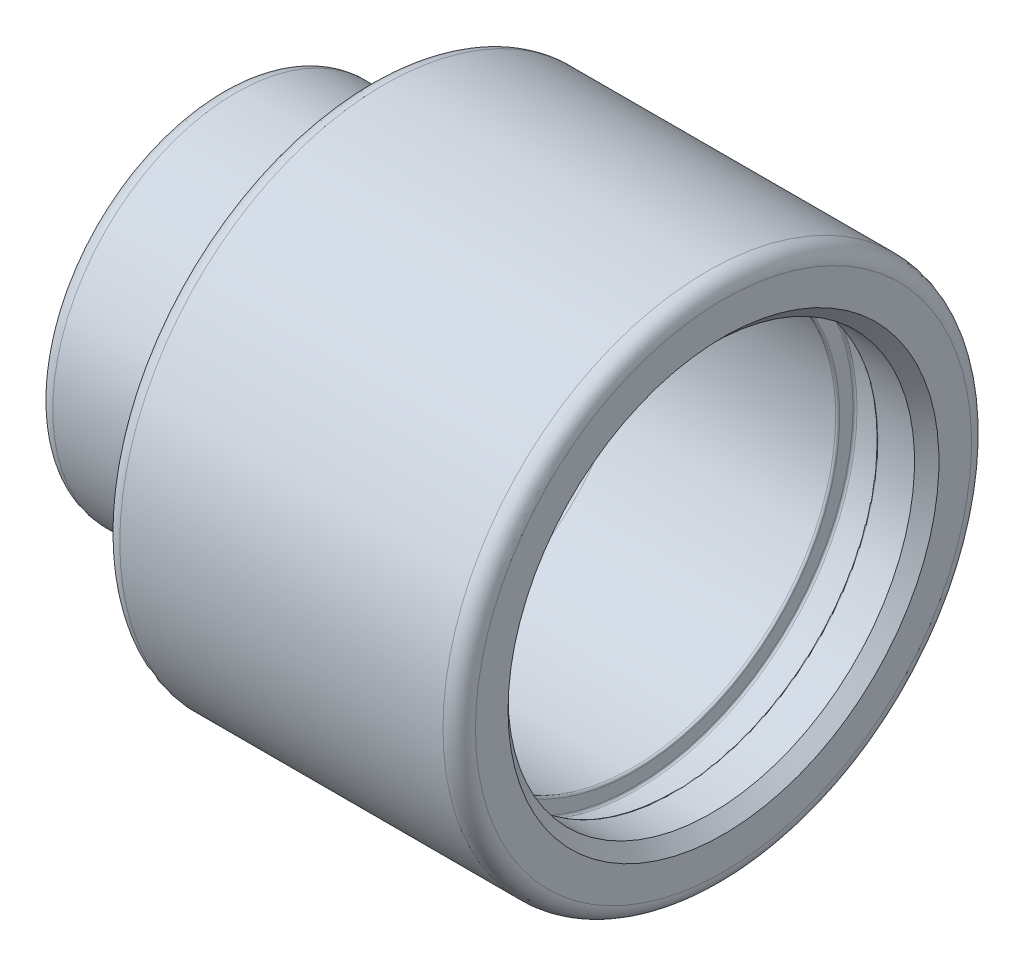
ISO-10303-21;
HEADER;
FILE_DESCRIPTION(('STEP AP214'),'2;1');
FILE_NAME('part.step','',(''),(''),'','','');
FILE_SCHEMA(('AUTOMOTIVE_DESIGN { 1 0 10303 214 1 1 1 1 }'));
ENDSEC;
DATA;
#1=APPLICATION_CONTEXT('core data for automotive mechanical design processes');
#2=APPLICATION_PROTOCOL_DEFINITION('international standard','automotive_design',2000,#1);
#3=PRODUCT_CONTEXT('',#1,'mechanical');
#4=PRODUCT('Part','Part','',(#3));
#5=PRODUCT_RELATED_PRODUCT_CATEGORY('part','',(#4));
#6=PRODUCT_DEFINITION_FORMATION('','',#4);
#7=PRODUCT_DEFINITION_CONTEXT('part definition',#1,'design');
#8=PRODUCT_DEFINITION('design','',#6,#7);
#9=PRODUCT_DEFINITION_SHAPE('','',#8);
#10=(LENGTH_UNIT() NAMED_UNIT(*) SI_UNIT(.MILLI.,.METRE.));
#11=(NAMED_UNIT(*) PLANE_ANGLE_UNIT() SI_UNIT($,.RADIAN.));
#12=(NAMED_UNIT(*) SI_UNIT($,.STERADIAN.) SOLID_ANGLE_UNIT());
#13=UNCERTAINTY_MEASURE_WITH_UNIT(LENGTH_MEASURE(1.E-05),#10,'distance_accuracy_value','');
#14=(GEOMETRIC_REPRESENTATION_CONTEXT(3) GLOBAL_UNCERTAINTY_ASSIGNED_CONTEXT((#13)) GLOBAL_UNIT_ASSIGNED_CONTEXT((#10,
#11,#12)) REPRESENTATION_CONTEXT('',''));
#15=CARTESIAN_POINT('',(0.,0.,0.));
#16=DIRECTION('',(0.,0.,1.));
#17=DIRECTION('',(1.,0.,0.));
#18=AXIS2_PLACEMENT_3D('',#15,#16,#17);
#19=CARTESIAN_POINT('',(-27.6897335930288,11.43,0.));
#20=DIRECTION('',(1.,0.,0.));
#21=DIRECTION('',(0.,0.,-1.));
#22=AXIS2_PLACEMENT_3D('',#19,#20,#21);
#23=PLANE('',#22);
#24=CARTESIAN_POINT('',(-27.6897335930288,0.,0.));
#25=DIRECTION('',(1.,0.,0.));
#26=DIRECTION('',(0.,0.,-1.));
#27=AXIS2_PLACEMENT_3D('',#24,#25,#26);
#28=CIRCLE('',#27,10.414);
#29=CARTESIAN_POINT('',(-27.6897335930288,0.,-10.414));
#30=VERTEX_POINT('',#29);
#31=EDGE_CURVE('E102',#30,#30,#28,.F.);
#32=ORIENTED_EDGE('',*,*,#31,.T.);
#33=EDGE_LOOP('',(#32));
#34=FACE_BOUND('',#33,.T.);
#35=CARTESIAN_POINT('',(-27.6897335930288,0.,0.));
#36=DIRECTION('',(1.,0.,0.));
#37=DIRECTION('',(0.,0.,-1.));
#38=AXIS2_PLACEMENT_3D('',#35,#36,#37);
#39=CIRCLE('',#38,8.38199999999997);
#40=CARTESIAN_POINT('',(-27.6897335930288,0.,-8.38199999999997));
#41=VERTEX_POINT('',#40);
#42=EDGE_CURVE('E132',#41,#41,#39,.T.);
#43=ORIENTED_EDGE('',*,*,#42,.T.);
#44=EDGE_LOOP('',(#43));
#45=FACE_BOUND('',#44,.T.);
#46=ADVANCED_FACE('F34',(#34,#45),#23,.F.);
#47=CARTESIAN_POINT('',(-425.207935606635,0.,0.));
#48=DIRECTION('',(-1.,0.,0.));
#49=DIRECTION('',(0.,0.,1.));
#50=AXIS2_PLACEMENT_3D('',#47,#48,#49);
#51=CYLINDRICAL_SURFACE('',#50,7.62);
#52=CARTESIAN_POINT('',(-24.6417335930288,0.,0.));
#53=DIRECTION('',(-1.,0.,0.));
#54=DIRECTION('',(0.,0.,1.));
#55=AXIS2_PLACEMENT_3D('',#52,#53,#54);
#56=CIRCLE('',#55,7.62);
#57=CARTESIAN_POINT('',(-24.6417335930288,0.,7.62));
#58=VERTEX_POINT('',#57);
#59=EDGE_CURVE('E81',#58,#58,#56,.F.);
#60=ORIENTED_EDGE('',*,*,#59,.T.);
#61=EDGE_LOOP('',(#60));
#62=FACE_BOUND('',#61,.T.);
#63=CARTESIAN_POINT('',(-26.9277335930289,0.,0.));
#64=DIRECTION('',(1.,0.,0.));
#65=DIRECTION('',(0.,0.,-1.));
#66=AXIS2_PLACEMENT_3D('',#63,#64,#65);
#67=CIRCLE('',#66,7.62);
#68=CARTESIAN_POINT('',(-26.9277335930289,0.,-7.62));
#69=VERTEX_POINT('',#68);
#70=EDGE_CURVE('E135',#69,#69,#67,.F.);
#71=ORIENTED_EDGE('',*,*,#70,.T.);
#72=EDGE_LOOP('',(#71));
#73=FACE_BOUND('',#72,.T.);
#74=ADVANCED_FACE('F139',(#62,#73),#51,.F.);
#75=CARTESIAN_POINT('',(-24.5147335930288,7.62,0.));
#76=DIRECTION('',(-1.,0.,0.));
#77=DIRECTION('',(0.,0.,1.));
#78=AXIS2_PLACEMENT_3D('',#75,#76,#77);
#79=PLANE('',#78);
#80=CARTESIAN_POINT('',(-24.5147335930288,0.,0.));
#81=DIRECTION('',(-1.,0.,0.));
#82=DIRECTION('',(0.,0.,1.));
#83=AXIS2_PLACEMENT_3D('',#80,#81,#82);
#84=CIRCLE('',#83,7.747);
#85=CARTESIAN_POINT('',(-24.5147335930288,0.,7.747));
#86=VERTEX_POINT('',#85);
#87=EDGE_CURVE('E84',#86,#86,#84,.T.);
#88=ORIENTED_EDGE('',*,*,#87,.T.);
#89=EDGE_LOOP('',(#88));
#90=FACE_BOUND('',#89,.T.);
#91=CARTESIAN_POINT('',(-24.5147335930288,0.,0.));
#92=DIRECTION('',(-1.,0.,0.));
#93=DIRECTION('',(0.,0.,1.));
#94=AXIS2_PLACEMENT_3D('',#91,#92,#93);
#95=CIRCLE('',#94,8.636);
#96=CARTESIAN_POINT('',(-24.5147335930288,0.,8.636));
#97=VERTEX_POINT('',#96);
#98=EDGE_CURVE('E87',#97,#97,#95,.F.);
#99=ORIENTED_EDGE('',*,*,#98,.T.);
#100=EDGE_LOOP('',(#99));
#101=FACE_BOUND('',#100,.T.);
#102=ADVANCED_FACE('F166',(#90,#101),#79,.F.);
#103=CARTESIAN_POINT('',(-425.207935606635,0.,0.));
#104=DIRECTION('',(-1.,0.,0.));
#105=DIRECTION('',(0.,0.,1.));
#106=AXIS2_PLACEMENT_3D('',#103,#104,#105);
#107=CYLINDRICAL_SURFACE('',#106,8.763);
#108=CARTESIAN_POINT('',(-24.3877335930288,0.,0.));
#109=DIRECTION('',(-1.,0.,0.));
#110=DIRECTION('',(0.,0.,1.));
#111=AXIS2_PLACEMENT_3D('',#108,#109,#110);
#112=CIRCLE('',#111,8.763);
#113=CARTESIAN_POINT('',(-24.3877335930288,0.,8.763));
#114=VERTEX_POINT('',#113);
#115=EDGE_CURVE('E75',#114,#114,#112,.T.);
#116=ORIENTED_EDGE('',*,*,#115,.T.);
#117=EDGE_LOOP('',(#116));
#118=FACE_BOUND('',#117,.T.);
#119=CARTESIAN_POINT('',(-22.2541335930288,0.,0.));
#120=DIRECTION('',(1.,0.,0.));
#121=DIRECTION('',(0.,0.,-1.));
#122=AXIS2_PLACEMENT_3D('',#119,#120,#121);
#123=CIRCLE('',#122,8.763);
#124=CARTESIAN_POINT('',(-22.2541335930288,0.,-8.763));
#125=VERTEX_POINT('',#124);
#126=EDGE_CURVE('E78',#125,#125,#123,.T.);
#127=ORIENTED_EDGE('',*,*,#126,.T.);
#128=EDGE_LOOP('',(#127));
#129=FACE_BOUND('',#128,.T.);
#130=ADVANCED_FACE('F173',(#118,#129),#107,.F.);
#131=CARTESIAN_POINT('',(-22.1271335930288,8.763,0.));
#132=DIRECTION('',(1.,0.,0.));
#133=DIRECTION('',(0.,0.,-1.));
#134=AXIS2_PLACEMENT_3D('',#131,#132,#133);
#135=PLANE('',#134);
#136=CARTESIAN_POINT('',(-22.1271335930288,0.,0.));
#137=DIRECTION('',(1.,0.,0.));
#138=DIRECTION('',(0.,0.,-1.));
#139=AXIS2_PLACEMENT_3D('',#136,#137,#138);
#140=CIRCLE('',#139,8.636);
#141=CARTESIAN_POINT('',(-22.1271335930288,0.,-8.636));
#142=VERTEX_POINT('',#141);
#143=EDGE_CURVE('E69',#142,#142,#140,.F.);
#144=ORIENTED_EDGE('',*,*,#143,.T.);
#145=EDGE_LOOP('',(#144));
#146=FACE_BOUND('',#145,.T.);
#147=CARTESIAN_POINT('',(-22.1271335930288,0.,0.));
#148=DIRECTION('',(1.,0.,0.));
#149=DIRECTION('',(0.,0.,-1.));
#150=AXIS2_PLACEMENT_3D('',#147,#148,#149);
#151=CIRCLE('',#150,7.747);
#152=CARTESIAN_POINT('',(-22.1271335930288,0.,-7.747));
#153=VERTEX_POINT('',#152);
#154=EDGE_CURVE('E72',#153,#153,#151,.T.);
#155=ORIENTED_EDGE('',*,*,#154,.T.);
#156=EDGE_LOOP('',(#155));
#157=FACE_BOUND('',#156,.T.);
#158=ADVANCED_FACE('F177',(#146,#157),#135,.F.);
#159=CARTESIAN_POINT('',(-425.207935606635,0.,0.));
#160=DIRECTION('',(-1.,0.,0.));
#161=DIRECTION('',(0.,0.,1.));
#162=AXIS2_PLACEMENT_3D('',#159,#160,#161);
#163=CYLINDRICAL_SURFACE('',#162,7.62);
#164=CARTESIAN_POINT('',(-22.0001335930288,0.,0.));
#165=DIRECTION('',(1.,0.,0.));
#166=DIRECTION('',(0.,0.,-1.));
#167=AXIS2_PLACEMENT_3D('',#164,#165,#166);
#168=CIRCLE('',#167,7.62);
#169=CARTESIAN_POINT('',(-22.0001335930288,0.,-7.62));
#170=VERTEX_POINT('',#169);
#171=EDGE_CURVE('E66',#170,#170,#168,.F.);
#172=ORIENTED_EDGE('',*,*,#171,.T.);
#173=EDGE_LOOP('',(#172));
#174=FACE_BOUND('',#173,.T.);
#175=CARTESIAN_POINT('',(-16.7677335930288,0.,0.));
#176=DIRECTION('',(-1.,0.,0.));
#177=DIRECTION('',(0.,0.,1.));
#178=AXIS2_PLACEMENT_3D('',#175,#176,#177);
#179=CIRCLE('',#178,7.62);
#180=CARTESIAN_POINT('',(-16.7677335930288,0.,7.62));
#181=VERTEX_POINT('',#180);
#182=EDGE_CURVE('E96',#181,#181,#179,.F.);
#183=ORIENTED_EDGE('',*,*,#182,.T.);
#184=EDGE_LOOP('',(#183));
#185=FACE_BOUND('',#184,.T.);
#186=ADVANCED_FACE('F181',(#174,#185),#163,.F.);
#187=CARTESIAN_POINT('',(-15.2437335930288,7.62,0.));
#188=DIRECTION('',(-1.,0.,0.));
#189=DIRECTION('',(0.,0.,1.));
#190=AXIS2_PLACEMENT_3D('',#187,#188,#189);
#191=PLANE('',#190);
#192=CARTESIAN_POINT('',(-15.2437335930288,0.,0.));
#193=DIRECTION('',(-1.,0.,0.));
#194=DIRECTION('',(0.,0.,1.));
#195=AXIS2_PLACEMENT_3D('',#192,#193,#194);
#196=CIRCLE('',#195,11.938);
#197=CARTESIAN_POINT('',(-15.2437335930288,0.,11.938));
#198=VERTEX_POINT('',#197);
#199=EDGE_CURVE('E90',#198,#198,#196,.F.);
#200=ORIENTED_EDGE('',*,*,#199,.T.);
#201=EDGE_LOOP('',(#200));
#202=FACE_BOUND('',#201,.T.);
#203=CARTESIAN_POINT('',(-15.2437335930288,0.,0.));
#204=DIRECTION('',(-1.,0.,0.));
#205=DIRECTION('',(0.,0.,1.));
#206=AXIS2_PLACEMENT_3D('',#203,#204,#205);
#207=CIRCLE('',#206,9.144);
#208=CARTESIAN_POINT('',(-15.2437335930288,0.,9.144));
#209=VERTEX_POINT('',#208);
#210=EDGE_CURVE('E99',#209,#209,#207,.T.);
#211=ORIENTED_EDGE('',*,*,#210,.T.);
#212=EDGE_LOOP('',(#211));
#213=FACE_BOUND('',#212,.T.);
#214=ADVANCED_FACE('F185',(#202,#213),#191,.F.);
#215=CARTESIAN_POINT('',(-425.207935606635,0.,0.));
#216=DIRECTION('',(-1.,0.,0.));
#217=DIRECTION('',(0.,0.,1.));
#218=AXIS2_PLACEMENT_3D('',#215,#216,#217);
#219=CYLINDRICAL_SURFACE('',#218,12.7);
#220=CARTESIAN_POINT('',(-1.88333359302884,0.,0.));
#221=DIRECTION('',(-1.,0.,0.));
#222=DIRECTION('',(0.,0.,1.));
#223=AXIS2_PLACEMENT_3D('',#220,#221,#222);
#224=CIRCLE('',#223,12.7);
#225=CARTESIAN_POINT('',(-1.88333359302884,0.,12.7));
#226=VERTEX_POINT('',#225);
#227=EDGE_CURVE('E10',#226,#226,#224,.F.);
#228=ORIENTED_EDGE('',*,*,#227,.T.);
#229=EDGE_LOOP('',(#228));
#230=FACE_BOUND('',#229,.T.);
#231=CARTESIAN_POINT('',(-14.4817335930288,0.,0.));
#232=DIRECTION('',(-1.,0.,0.));
#233=DIRECTION('',(0.,0.,1.));
#234=AXIS2_PLACEMENT_3D('',#231,#232,#233);
#235=CIRCLE('',#234,12.7);
#236=CARTESIAN_POINT('',(-14.4817335930288,0.,12.7));
#237=VERTEX_POINT('',#236);
#238=EDGE_CURVE('E93',#237,#237,#235,.T.);
#239=ORIENTED_EDGE('',*,*,#238,.T.);
#240=EDGE_LOOP('',(#239));
#241=FACE_BOUND('',#240,.T.);
#242=ADVANCED_FACE('F189',(#230,#241),#219,.F.);
#243=CARTESIAN_POINT('',(-1.75633359302883,12.7,0.));
#244=DIRECTION('',(-1.,0.,0.));
#245=DIRECTION('',(0.,0.,1.));
#246=AXIS2_PLACEMENT_3D('',#243,#244,#245);
#247=PLANE('',#246);
#248=CARTESIAN_POINT('',(-1.75633359302883,0.,0.));
#249=DIRECTION('',(-1.,0.,0.));
#250=DIRECTION('',(0.,0.,1.));
#251=AXIS2_PLACEMENT_3D('',#248,#249,#250);
#252=CIRCLE('',#251,12.827);
#253=CARTESIAN_POINT('',(-1.75633359302883,0.,12.827));
#254=VERTEX_POINT('',#253);
#255=EDGE_CURVE('E41',#254,#254,#252,.T.);
#256=ORIENTED_EDGE('',*,*,#255,.T.);
#257=EDGE_LOOP('',(#256));
#258=FACE_BOUND('',#257,.T.);
#259=CARTESIAN_POINT('',(-1.75633359302883,0.,0.));
#260=DIRECTION('',(-1.,0.,0.));
#261=DIRECTION('',(0.,0.,1.));
#262=AXIS2_PLACEMENT_3D('',#259,#260,#261);
#263=CIRCLE('',#262,13.6525);
#264=CARTESIAN_POINT('',(-1.75633359302883,0.,13.6525));
#265=VERTEX_POINT('',#264);
#266=EDGE_CURVE('E45',#265,#265,#263,.F.);
#267=ORIENTED_EDGE('',*,*,#266,.T.);
#268=EDGE_LOOP('',(#267));
#269=FACE_BOUND('',#268,.T.);
#270=ADVANCED_FACE('F193',(#258,#269),#247,.F.);
#271=CARTESIAN_POINT('',(-425.207935606635,0.,0.));
#272=DIRECTION('',(-1.,0.,0.));
#273=DIRECTION('',(0.,0.,1.));
#274=AXIS2_PLACEMENT_3D('',#271,#272,#273);
#275=CYLINDRICAL_SURFACE('',#274,13.7795);
#276=CARTESIAN_POINT('',(0.504266406971154,0.,0.));
#277=DIRECTION('',(1.,0.,0.));
#278=DIRECTION('',(0.,0.,-1.));
#279=AXIS2_PLACEMENT_3D('',#276,#277,#278);
#280=CIRCLE('',#279,13.7795);
#281=CARTESIAN_POINT('',(0.504266406971154,0.,-13.7795));
#282=VERTEX_POINT('',#281);
#283=EDGE_CURVE('E54',#282,#282,#280,.T.);
#284=ORIENTED_EDGE('',*,*,#283,.T.);
#285=EDGE_LOOP('',(#284));
#286=FACE_BOUND('',#285,.T.);
#287=CARTESIAN_POINT('',(-1.6293335930288,0.,0.));
#288=DIRECTION('',(-1.,0.,0.));
#289=DIRECTION('',(0.,0.,1.));
#290=AXIS2_PLACEMENT_3D('',#287,#288,#289);
#291=CIRCLE('',#290,13.7795);
#292=CARTESIAN_POINT('',(-1.6293335930288,0.,13.7795));
#293=VERTEX_POINT('',#292);
#294=EDGE_CURVE('E57',#293,#293,#291,.T.);
#295=ORIENTED_EDGE('',*,*,#294,.T.);
#296=EDGE_LOOP('',(#295));
#297=FACE_BOUND('',#296,.T.);
#298=ADVANCED_FACE('F196',(#286,#297),#275,.F.);
#299=CARTESIAN_POINT('',(0.631266406971172,13.7795,0.));
#300=DIRECTION('',(1.,0.,0.));
#301=DIRECTION('',(0.,0.,-1.));
#302=AXIS2_PLACEMENT_3D('',#299,#300,#301);
#303=PLANE('',#302);
#304=CARTESIAN_POINT('',(0.631266406971172,0.,0.));
#305=DIRECTION('',(1.,0.,0.));
#306=DIRECTION('',(0.,0.,-1.));
#307=AXIS2_PLACEMENT_3D('',#304,#305,#306);
#308=CIRCLE('',#307,13.6525);
#309=CARTESIAN_POINT('',(0.631266406971172,0.,-13.6525));
#310=VERTEX_POINT('',#309);
#311=EDGE_CURVE('E60',#310,#310,#308,.F.);
#312=ORIENTED_EDGE('',*,*,#311,.T.);
#313=EDGE_LOOP('',(#312));
#314=FACE_BOUND('',#313,.T.);
#315=CARTESIAN_POINT('',(0.631266406971172,0.,0.));
#316=DIRECTION('',(1.,0.,0.));
#317=DIRECTION('',(0.,0.,-1.));
#318=AXIS2_PLACEMENT_3D('',#315,#316,#317);
#319=CIRCLE('',#318,12.827);
#320=CARTESIAN_POINT('',(0.631266406971172,0.,-12.827));
#321=VERTEX_POINT('',#320);
#322=EDGE_CURVE('E63',#321,#321,#319,.T.);
#323=ORIENTED_EDGE('',*,*,#322,.T.);
#324=EDGE_LOOP('',(#323));
#325=FACE_BOUND('',#324,.T.);
#326=ADVANCED_FACE('F199',(#314,#325),#303,.F.);
#327=CARTESIAN_POINT('',(-425.207935606635,0.,0.));
#328=DIRECTION('',(-1.,0.,0.));
#329=DIRECTION('',(0.,0.,1.));
#330=AXIS2_PLACEMENT_3D('',#327,#328,#329);
#331=CYLINDRICAL_SURFACE('',#330,12.7);
#332=CARTESIAN_POINT('',(0.758266406971186,0.,0.));
#333=DIRECTION('',(1.,0.,0.));
#334=DIRECTION('',(0.,0.,-1.));
#335=AXIS2_PLACEMENT_3D('',#332,#333,#334);
#336=CIRCLE('',#335,12.7);
#337=CARTESIAN_POINT('',(0.758266406971186,0.,-12.7));
#338=VERTEX_POINT('',#337);
#339=EDGE_CURVE('E49',#338,#338,#336,.F.);
#340=ORIENTED_EDGE('',*,*,#339,.T.);
#341=EDGE_LOOP('',(#340));
#342=FACE_BOUND('',#341,.T.);
#343=CARTESIAN_POINT('',(3.04426640697114,0.,0.));
#344=DIRECTION('',(-1.,0.,0.));
#345=DIRECTION('',(0.,0.,1.));
#346=AXIS2_PLACEMENT_3D('',#343,#344,#345);
#347=CIRCLE('',#346,12.7);
#348=CARTESIAN_POINT('',(3.04426640697114,0.,12.7));
#349=VERTEX_POINT('',#348);
#350=EDGE_CURVE('E126',#349,#349,#347,.F.);
#351=ORIENTED_EDGE('',*,*,#350,.T.);
#352=EDGE_LOOP('',(#351));
#353=FACE_BOUND('',#352,.T.);
#354=ADVANCED_FACE('F203',(#342,#353),#331,.F.);
#355=CARTESIAN_POINT('',(3.80626640697117,12.7,0.));
#356=DIRECTION('',(-1.,0.,0.));
#357=DIRECTION('',(0.,0.,1.));
#358=AXIS2_PLACEMENT_3D('',#355,#356,#357);
#359=PLANE('',#358);
#360=CARTESIAN_POINT('',(3.80626640697117,0.,0.));
#361=DIRECTION('',(-1.,0.,0.));
#362=DIRECTION('',(0.,0.,1.));
#363=AXIS2_PLACEMENT_3D('',#360,#361,#362);
#364=CIRCLE('',#363,15.494);
#365=CARTESIAN_POINT('',(3.80626640697117,0.,15.494));
#366=VERTEX_POINT('',#365);
#367=EDGE_CURVE('E117',#366,#366,#364,.F.);
#368=ORIENTED_EDGE('',*,*,#367,.T.);
#369=EDGE_LOOP('',(#368));
#370=FACE_BOUND('',#369,.T.);
#371=CARTESIAN_POINT('',(3.80626640697117,0.,0.));
#372=DIRECTION('',(-1.,0.,0.));
#373=DIRECTION('',(0.,0.,1.));
#374=AXIS2_PLACEMENT_3D('',#371,#372,#373);
#375=CIRCLE('',#374,13.462);
#376=CARTESIAN_POINT('',(3.80626640697117,0.,13.462));
#377=VERTEX_POINT('',#376);
#378=EDGE_CURVE('E129',#377,#377,#375,.T.);
#379=ORIENTED_EDGE('',*,*,#378,.T.);
#380=EDGE_LOOP('',(#379));
#381=FACE_BOUND('',#380,.T.);
#382=ADVANCED_FACE('F207',(#370,#381),#359,.F.);
#383=CARTESIAN_POINT('',(-425.207935606635,0.,0.));
#384=DIRECTION('',(-1.,0.,0.));
#385=DIRECTION('',(0.,0.,1.));
#386=AXIS2_PLACEMENT_3D('',#383,#384,#385);
#387=CYLINDRICAL_SURFACE('',#386,16.51);
#388=CARTESIAN_POINT('',(2.79026640697116,0.,0.));
#389=DIRECTION('',(-1.,0.,0.));
#390=DIRECTION('',(0.,0.,1.));
#391=AXIS2_PLACEMENT_3D('',#388,#389,#390);
#392=CIRCLE('',#391,16.51);
#393=CARTESIAN_POINT('',(2.79026640697116,0.,16.51));
#394=VERTEX_POINT('',#393);
#395=EDGE_CURVE('E120',#394,#394,#392,.T.);
#396=ORIENTED_EDGE('',*,*,#395,.T.);
#397=EDGE_LOOP('',(#396));
#398=FACE_BOUND('',#397,.T.);
#399=CARTESIAN_POINT('',(-17.4027335930289,0.,0.));
#400=DIRECTION('',(1.,0.,0.));
#401=DIRECTION('',(0.,0.,-1.));
#402=AXIS2_PLACEMENT_3D('',#399,#400,#401);
#403=CIRCLE('',#402,16.51);
#404=CARTESIAN_POINT('',(-17.4027335930289,0.,-16.51));
#405=VERTEX_POINT('',#404);
#406=EDGE_CURVE('E123',#405,#405,#403,.T.);
#407=ORIENTED_EDGE('',*,*,#406,.T.);
#408=EDGE_LOOP('',(#407));
#409=FACE_BOUND('',#408,.T.);
#410=ADVANCED_FACE('F211',(#398,#409),#387,.T.);
#411=CARTESIAN_POINT('',(-18.4187335930288,16.51,0.));
#412=DIRECTION('',(1.,0.,0.));
#413=DIRECTION('',(0.,0.,-1.));
#414=AXIS2_PLACEMENT_3D('',#411,#412,#413);
#415=PLANE('',#414);
#416=CARTESIAN_POINT('',(-18.4187335930288,0.,0.));
#417=DIRECTION('',(1.,0.,0.));
#418=DIRECTION('',(0.,0.,-1.));
#419=AXIS2_PLACEMENT_3D('',#416,#417,#418);
#420=CIRCLE('',#419,15.494);
#421=CARTESIAN_POINT('',(-18.4187335930288,0.,-15.494));
#422=VERTEX_POINT('',#421);
#423=EDGE_CURVE('E111',#422,#422,#420,.F.);
#424=ORIENTED_EDGE('',*,*,#423,.T.);
#425=EDGE_LOOP('',(#424));
#426=FACE_BOUND('',#425,.T.);
#427=CARTESIAN_POINT('',(-18.4187335930288,0.,0.));
#428=DIRECTION('',(1.,0.,0.));
#429=DIRECTION('',(0.,0.,-1.));
#430=AXIS2_PLACEMENT_3D('',#427,#428,#429);
#431=CIRCLE('',#430,12.446);
#432=CARTESIAN_POINT('',(-18.4187335930288,0.,-12.446));
#433=VERTEX_POINT('',#432);
#434=EDGE_CURVE('E114',#433,#433,#431,.T.);
#435=ORIENTED_EDGE('',*,*,#434,.T.);
#436=EDGE_LOOP('',(#435));
#437=FACE_BOUND('',#436,.T.);
#438=ADVANCED_FACE('F154',(#426,#437),#415,.F.);
#439=CARTESIAN_POINT('',(-425.207935606635,0.,0.));
#440=DIRECTION('',(-1.,0.,0.));
#441=DIRECTION('',(0.,0.,1.));
#442=AXIS2_PLACEMENT_3D('',#439,#440,#441);
#443=CYLINDRICAL_SURFACE('',#442,11.43);
#444=CARTESIAN_POINT('',(-19.4347335930288,0.,0.));
#445=DIRECTION('',(1.,0.,0.));
#446=DIRECTION('',(0.,0.,-1.));
#447=AXIS2_PLACEMENT_3D('',#444,#445,#446);
#448=CIRCLE('',#447,11.43);
#449=CARTESIAN_POINT('',(-19.4347335930288,0.,-11.43));
#450=VERTEX_POINT('',#449);
#451=EDGE_CURVE('E105',#450,#450,#448,.F.);
#452=ORIENTED_EDGE('',*,*,#451,.T.);
#453=EDGE_LOOP('',(#452));
#454=FACE_BOUND('',#453,.T.);
#455=CARTESIAN_POINT('',(-26.6737335930288,0.,0.));
#456=DIRECTION('',(1.,0.,0.));
#457=DIRECTION('',(0.,0.,-1.));
#458=AXIS2_PLACEMENT_3D('',#455,#456,#457);
#459=CIRCLE('',#458,11.43);
#460=CARTESIAN_POINT('',(-26.6737335930288,0.,-11.43));
#461=VERTEX_POINT('',#460);
#462=EDGE_CURVE('E108',#461,#461,#459,.T.);
#463=ORIENTED_EDGE('',*,*,#462,.T.);
#464=EDGE_LOOP('',(#463));
#465=FACE_BOUND('',#464,.T.);
#466=ADVANCED_FACE('F144',(#454,#465),#443,.T.);
#467=CARTESIAN_POINT('',(-26.9277335930289,0.,0.));
#468=DIRECTION('',(-1.,0.,0.));
#469=DIRECTION('',(0.,0.,1.));
#470=AXIS2_PLACEMENT_3D('',#467,#468,#469);
#471=CONICAL_SURFACE('',#470,7.62,0.785398163397449);
#472=ORIENTED_EDGE('',*,*,#42,.F.);
#473=EDGE_LOOP('',(#472));
#474=FACE_BOUND('',#473,.T.);
#475=ORIENTED_EDGE('',*,*,#70,.F.);
#476=EDGE_LOOP('',(#475));
#477=FACE_BOUND('',#476,.T.);
#478=ADVANCED_FACE('F141',(#474,#477),#471,.F.);
#479=CARTESIAN_POINT('',(3.80626640697118,0.,0.));
#480=DIRECTION('',(1.,0.,0.));
#481=DIRECTION('',(0.,0.,-1.));
#482=AXIS2_PLACEMENT_3D('',#479,#480,#481);
#483=CONICAL_SURFACE('',#482,13.462,0.78539816339743);
#484=ORIENTED_EDGE('',*,*,#350,.F.);
#485=EDGE_LOOP('',(#484));
#486=FACE_BOUND('',#485,.T.);
#487=ORIENTED_EDGE('',*,*,#378,.F.);
#488=EDGE_LOOP('',(#487));
#489=FACE_BOUND('',#488,.T.);
#490=ADVANCED_FACE('F143',(#486,#489),#483,.F.);
#491=CARTESIAN_POINT('',(2.79026640697116,0.,0.));
#492=DIRECTION('',(-1.,0.,0.));
#493=DIRECTION('',(0.,0.,1.));
#494=AXIS2_PLACEMENT_3D('',#491,#492,#493);
#495=TOROIDAL_SURFACE('',#494,15.494,1.016);
#496=ORIENTED_EDGE('',*,*,#367,.F.);
#497=EDGE_LOOP('',(#496));
#498=FACE_BOUND('',#497,.T.);
#499=ORIENTED_EDGE('',*,*,#395,.F.);
#500=EDGE_LOOP('',(#499));
#501=FACE_BOUND('',#500,.T.);
#502=ADVANCED_FACE('F151',(#498,#501),#495,.T.);
#503=CARTESIAN_POINT('',(-17.4027335930289,0.,0.));
#504=DIRECTION('',(1.,0.,0.));
#505=DIRECTION('',(0.,0.,-1.));
#506=AXIS2_PLACEMENT_3D('',#503,#504,#505);
#507=TOROIDAL_SURFACE('',#506,15.494,1.016);
#508=ORIENTED_EDGE('',*,*,#406,.F.);
#509=EDGE_LOOP('',(#508));
#510=FACE_BOUND('',#509,.T.);
#511=ORIENTED_EDGE('',*,*,#423,.F.);
#512=EDGE_LOOP('',(#511));
#513=FACE_BOUND('',#512,.T.);
#514=ADVANCED_FACE('F228',(#510,#513),#507,.T.);
#515=CARTESIAN_POINT('',(-19.4347335930288,0.,0.));
#516=DIRECTION('',(1.,0.,0.));
#517=DIRECTION('',(0.,0.,-1.));
#518=AXIS2_PLACEMENT_3D('',#515,#516,#517);
#519=TOROIDAL_SURFACE('',#518,12.446,1.016);
#520=ORIENTED_EDGE('',*,*,#434,.F.);
#521=EDGE_LOOP('',(#520));
#522=FACE_BOUND('',#521,.T.);
#523=ORIENTED_EDGE('',*,*,#451,.F.);
#524=EDGE_LOOP('',(#523));
#525=FACE_BOUND('',#524,.T.);
#526=ADVANCED_FACE('F224',(#522,#525),#519,.F.);
#527=CARTESIAN_POINT('',(-26.6737335930288,0.,0.));
#528=DIRECTION('',(1.,0.,0.));
#529=DIRECTION('',(0.,0.,-1.));
#530=AXIS2_PLACEMENT_3D('',#527,#528,#529);
#531=TOROIDAL_SURFACE('',#530,10.414,1.016);
#532=ORIENTED_EDGE('',*,*,#462,.F.);
#533=EDGE_LOOP('',(#532));
#534=FACE_BOUND('',#533,.T.);
#535=ORIENTED_EDGE('',*,*,#31,.F.);
#536=EDGE_LOOP('',(#535));
#537=FACE_BOUND('',#536,.T.);
#538=ADVANCED_FACE('F227',(#534,#537),#531,.T.);
#539=CARTESIAN_POINT('',(-16.7677335930288,0.,0.));
#540=DIRECTION('',(-1.,0.,0.));
#541=DIRECTION('',(0.,0.,1.));
#542=AXIS2_PLACEMENT_3D('',#539,#540,#541);
#543=TOROIDAL_SURFACE('',#542,9.144,1.524);
#544=ORIENTED_EDGE('',*,*,#182,.F.);
#545=EDGE_LOOP('',(#544));
#546=FACE_BOUND('',#545,.T.);
#547=ORIENTED_EDGE('',*,*,#210,.F.);
#548=EDGE_LOOP('',(#547));
#549=FACE_BOUND('',#548,.T.);
#550=ADVANCED_FACE('F236',(#546,#549),#543,.T.);
#551=CARTESIAN_POINT('',(-14.4817335930288,0.,0.));
#552=DIRECTION('',(-1.,0.,0.));
#553=DIRECTION('',(0.,0.,1.));
#554=AXIS2_PLACEMENT_3D('',#551,#552,#553);
#555=TOROIDAL_SURFACE('',#554,11.938,0.762);
#556=ORIENTED_EDGE('',*,*,#199,.F.);
#557=EDGE_LOOP('',(#556));
#558=FACE_BOUND('',#557,.T.);
#559=ORIENTED_EDGE('',*,*,#238,.F.);
#560=EDGE_LOOP('',(#559));
#561=FACE_BOUND('',#560,.T.);
#562=ADVANCED_FACE('F242',(#558,#561),#555,.F.);
#563=CARTESIAN_POINT('',(-24.6417335930288,0.,0.));
#564=DIRECTION('',(-1.,0.,0.));
#565=DIRECTION('',(0.,0.,1.));
#566=AXIS2_PLACEMENT_3D('',#563,#564,#565);
#567=TOROIDAL_SURFACE('',#566,7.747,0.127);
#568=ORIENTED_EDGE('',*,*,#59,.F.);
#569=EDGE_LOOP('',(#568));
#570=FACE_BOUND('',#569,.T.);
#571=ORIENTED_EDGE('',*,*,#87,.F.);
#572=EDGE_LOOP('',(#571));
#573=FACE_BOUND('',#572,.T.);
#574=ADVANCED_FACE('F249',(#570,#573),#567,.T.);
#575=CARTESIAN_POINT('',(-24.3877335930288,0.,0.));
#576=DIRECTION('',(-1.,0.,0.));
#577=DIRECTION('',(0.,0.,1.));
#578=AXIS2_PLACEMENT_3D('',#575,#576,#577);
#579=TOROIDAL_SURFACE('',#578,8.636,0.127);
#580=ORIENTED_EDGE('',*,*,#98,.F.);
#581=EDGE_LOOP('',(#580));
#582=FACE_BOUND('',#581,.T.);
#583=ORIENTED_EDGE('',*,*,#115,.F.);
#584=EDGE_LOOP('',(#583));
#585=FACE_BOUND('',#584,.T.);
#586=ADVANCED_FACE('F253',(#582,#585),#579,.F.);
#587=CARTESIAN_POINT('',(-22.2541335930288,0.,0.));
#588=DIRECTION('',(1.,0.,0.));
#589=DIRECTION('',(0.,0.,-1.));
#590=AXIS2_PLACEMENT_3D('',#587,#588,#589);
#591=TOROIDAL_SURFACE('',#590,8.636,0.127);
#592=ORIENTED_EDGE('',*,*,#126,.F.);
#593=EDGE_LOOP('',(#592));
#594=FACE_BOUND('',#593,.T.);
#595=ORIENTED_EDGE('',*,*,#143,.F.);
#596=EDGE_LOOP('',(#595));
#597=FACE_BOUND('',#596,.T.);
#598=ADVANCED_FACE('F257',(#594,#597),#591,.F.);
#599=CARTESIAN_POINT('',(-22.0001335930288,0.,0.));
#600=DIRECTION('',(1.,0.,0.));
#601=DIRECTION('',(0.,0.,-1.));
#602=AXIS2_PLACEMENT_3D('',#599,#600,#601);
#603=TOROIDAL_SURFACE('',#602,7.747,0.127);
#604=ORIENTED_EDGE('',*,*,#154,.F.);
#605=EDGE_LOOP('',(#604));
#606=FACE_BOUND('',#605,.T.);
#607=ORIENTED_EDGE('',*,*,#171,.F.);
#608=EDGE_LOOP('',(#607));
#609=FACE_BOUND('',#608,.T.);
#610=ADVANCED_FACE('F261',(#606,#609),#603,.T.);
#611=CARTESIAN_POINT('',(0.504266406971154,0.,0.));
#612=DIRECTION('',(1.,0.,0.));
#613=DIRECTION('',(0.,0.,-1.));
#614=AXIS2_PLACEMENT_3D('',#611,#612,#613);
#615=TOROIDAL_SURFACE('',#614,13.6525,0.127);
#616=ORIENTED_EDGE('',*,*,#283,.F.);
#617=EDGE_LOOP('',(#616));
#618=FACE_BOUND('',#617,.T.);
#619=ORIENTED_EDGE('',*,*,#311,.F.);
#620=EDGE_LOOP('',(#619));
#621=FACE_BOUND('',#620,.T.);
#622=ADVANCED_FACE('F265',(#618,#621),#615,.F.);
#623=CARTESIAN_POINT('',(0.758266406971186,0.,0.));
#624=DIRECTION('',(1.,0.,0.));
#625=DIRECTION('',(0.,0.,-1.));
#626=AXIS2_PLACEMENT_3D('',#623,#624,#625);
#627=TOROIDAL_SURFACE('',#626,12.827,0.127);
#628=ORIENTED_EDGE('',*,*,#322,.F.);
#629=EDGE_LOOP('',(#628));
#630=FACE_BOUND('',#629,.T.);
#631=ORIENTED_EDGE('',*,*,#339,.F.);
#632=EDGE_LOOP('',(#631));
#633=FACE_BOUND('',#632,.T.);
#634=ADVANCED_FACE('F269',(#630,#633),#627,.T.);
#635=CARTESIAN_POINT('',(-1.88333359302884,0.,0.));
#636=DIRECTION('',(-1.,0.,0.));
#637=DIRECTION('',(0.,0.,1.));
#638=AXIS2_PLACEMENT_3D('',#635,#636,#637);
#639=TOROIDAL_SURFACE('',#638,12.827,0.127);
#640=ORIENTED_EDGE('',*,*,#227,.F.);
#641=EDGE_LOOP('',(#640));
#642=FACE_BOUND('',#641,.T.);
#643=ORIENTED_EDGE('',*,*,#255,.F.);
#644=EDGE_LOOP('',(#643));
#645=FACE_BOUND('',#644,.T.);
#646=ADVANCED_FACE('F272',(#642,#645),#639,.T.);
#647=CARTESIAN_POINT('',(-1.6293335930288,0.,0.));
#648=DIRECTION('',(-1.,0.,0.));
#649=DIRECTION('',(0.,0.,1.));
#650=AXIS2_PLACEMENT_3D('',#647,#648,#649);
#651=TOROIDAL_SURFACE('',#650,13.6525,0.127);
#652=ORIENTED_EDGE('',*,*,#266,.F.);
#653=EDGE_LOOP('',(#652));
#654=FACE_BOUND('',#653,.T.);
#655=ORIENTED_EDGE('',*,*,#294,.F.);
#656=EDGE_LOOP('',(#655));
#657=FACE_BOUND('',#656,.T.);
#658=ADVANCED_FACE('F36',(#654,#657),#651,.F.);
#659=CLOSED_SHELL('',(#46,#74,#102,#130,#158,#186,#214,#242,#270,#298,#326,#354,#382,#410,#438,
#466,#478,#490,#502,#514,#526,#538,#550,#562,#574,#586,#598,#610,#622,#634,#646,#658));
#660=MANIFOLD_SOLID_BREP('B2',#659);
#661=ADVANCED_BREP_SHAPE_REPRESENTATION('',(#18,#660),#14);
#662=SHAPE_DEFINITION_REPRESENTATION(#9,#661);
ENDSEC;
END-ISO-10303-21;
